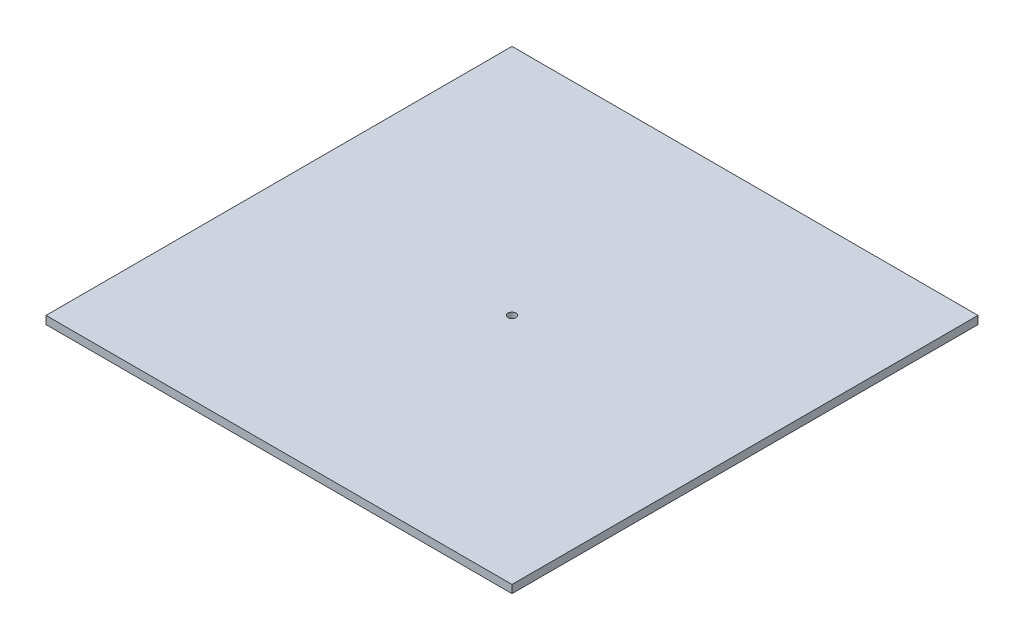
ISO-10303-21;
HEADER;
FILE_DESCRIPTION(('STEP AP214'),'2;1');
FILE_NAME('part.step','',(''),(''),'','','');
FILE_SCHEMA(('AUTOMOTIVE_DESIGN { 1 0 10303 214 1 1 1 1 }'));
ENDSEC;
DATA;
#1=APPLICATION_CONTEXT('core data for automotive mechanical design processes');
#2=APPLICATION_PROTOCOL_DEFINITION('international standard','automotive_design',2000,#1);
#3=PRODUCT_CONTEXT('',#1,'mechanical');
#4=PRODUCT('Part','Part','',(#3));
#5=PRODUCT_RELATED_PRODUCT_CATEGORY('part','',(#4));
#6=PRODUCT_DEFINITION_FORMATION('','',#4);
#7=PRODUCT_DEFINITION_CONTEXT('part definition',#1,'design');
#8=PRODUCT_DEFINITION('design','',#6,#7);
#9=PRODUCT_DEFINITION_SHAPE('','',#8);
#10=(LENGTH_UNIT() NAMED_UNIT(*) SI_UNIT(.MILLI.,.METRE.));
#11=(NAMED_UNIT(*) PLANE_ANGLE_UNIT() SI_UNIT($,.RADIAN.));
#12=(NAMED_UNIT(*) SI_UNIT($,.STERADIAN.) SOLID_ANGLE_UNIT());
#13=UNCERTAINTY_MEASURE_WITH_UNIT(LENGTH_MEASURE(1.E-05),#10,'distance_accuracy_value','');
#14=(GEOMETRIC_REPRESENTATION_CONTEXT(3) GLOBAL_UNCERTAINTY_ASSIGNED_CONTEXT((#13)) GLOBAL_UNIT_ASSIGNED_CONTEXT((#10,
#11,#12)) REPRESENTATION_CONTEXT('',''));
#15=CARTESIAN_POINT('',(0.,0.,0.));
#16=DIRECTION('',(0.,0.,1.));
#17=DIRECTION('',(1.,0.,0.));
#18=AXIS2_PLACEMENT_3D('',#15,#16,#17);
#19=CARTESIAN_POINT('',(175.,6.00000000000001,175.));
#20=DIRECTION('',(-1.,0.,0.));
#21=DIRECTION('',(0.,0.,1.));
#22=AXIS2_PLACEMENT_3D('',#19,#20,#21);
#23=PLANE('',#22);
#24=DIRECTION('',(0.,0.,-1.));
#25=VECTOR('',#24,1.);
#26=CARTESIAN_POINT('',(175.,0.,175.));
#27=LINE('',#26,#25);
#28=CARTESIAN_POINT('',(175.,0.,175.));
#29=VERTEX_POINT('',#28);
#30=CARTESIAN_POINT('',(175.,0.,-175.));
#31=VERTEX_POINT('',#30);
#32=EDGE_CURVE('E98',#29,#31,#27,.T.);
#33=ORIENTED_EDGE('',*,*,#32,.T.);
#34=DIRECTION('',(0.,-1.,0.));
#35=VECTOR('',#34,1.);
#36=CARTESIAN_POINT('',(175.,6.00000000000001,-175.));
#37=LINE('',#36,#35);
#38=CARTESIAN_POINT('',(175.,6.00000000000001,-175.));
#39=VERTEX_POINT('',#38);
#40=EDGE_CURVE('E11',#39,#31,#37,.T.);
#41=ORIENTED_EDGE('',*,*,#40,.F.);
#42=DIRECTION('',(0.,0.,-1.));
#43=VECTOR('',#42,1.);
#44=CARTESIAN_POINT('',(175.,6.00000000000001,175.));
#45=LINE('',#44,#43);
#46=CARTESIAN_POINT('',(175.,6.00000000000001,175.));
#47=VERTEX_POINT('',#46);
#48=EDGE_CURVE('E86',#47,#39,#45,.T.);
#49=ORIENTED_EDGE('',*,*,#48,.F.);
#50=DIRECTION('',(0.,-1.,0.));
#51=VECTOR('',#50,1.);
#52=CARTESIAN_POINT('',(175.,6.00000000000001,175.));
#53=LINE('',#52,#51);
#54=EDGE_CURVE('E94',#47,#29,#53,.T.);
#55=ORIENTED_EDGE('',*,*,#54,.T.);
#56=EDGE_LOOP('',(#33,#41,#49,#55));
#57=FACE_BOUND('',#56,.T.);
#58=ADVANCED_FACE('F35',(#57),#23,.F.);
#59=CARTESIAN_POINT('',(-175.,6.00000000000001,-175.));
#60=DIRECTION('',(0.,0.,1.));
#61=DIRECTION('',(1.,0.,0.));
#62=AXIS2_PLACEMENT_3D('',#59,#60,#61);
#63=PLANE('',#62);
#64=DIRECTION('',(-1.,0.,0.));
#65=VECTOR('',#64,1.);
#66=CARTESIAN_POINT('',(-175.,0.,-175.));
#67=LINE('',#66,#65);
#68=CARTESIAN_POINT('',(-175.,0.,-175.));
#69=VERTEX_POINT('',#68);
#70=EDGE_CURVE('E90',#31,#69,#67,.T.);
#71=ORIENTED_EDGE('',*,*,#70,.T.);
#72=DIRECTION('',(0.,-1.,0.));
#73=VECTOR('',#72,1.);
#74=CARTESIAN_POINT('',(-175.,6.00000000000001,-175.));
#75=LINE('',#74,#73);
#76=CARTESIAN_POINT('',(-175.,6.00000000000001,-175.));
#77=VERTEX_POINT('',#76);
#78=EDGE_CURVE('E43',#77,#69,#75,.T.);
#79=ORIENTED_EDGE('',*,*,#78,.F.);
#80=DIRECTION('',(-1.,0.,0.));
#81=VECTOR('',#80,1.);
#82=CARTESIAN_POINT('',(-175.,6.00000000000001,-175.));
#83=LINE('',#82,#81);
#84=EDGE_CURVE('E81',#39,#77,#83,.T.);
#85=ORIENTED_EDGE('',*,*,#84,.F.);
#86=ORIENTED_EDGE('',*,*,#40,.T.);
#87=EDGE_LOOP('',(#71,#79,#85,#86));
#88=FACE_BOUND('',#87,.T.);
#89=ADVANCED_FACE('F89',(#88),#63,.F.);
#90=CARTESIAN_POINT('',(-175.,6.00000000000001,175.));
#91=DIRECTION('',(1.,0.,0.));
#92=DIRECTION('',(0.,0.,-1.));
#93=AXIS2_PLACEMENT_3D('',#90,#91,#92);
#94=PLANE('',#93);
#95=DIRECTION('',(0.,0.,1.));
#96=VECTOR('',#95,1.);
#97=CARTESIAN_POINT('',(-175.,0.,175.));
#98=LINE('',#97,#96);
#99=CARTESIAN_POINT('',(-175.,0.,175.));
#100=VERTEX_POINT('',#99);
#101=EDGE_CURVE('E68',#69,#100,#98,.T.);
#102=ORIENTED_EDGE('',*,*,#101,.T.);
#103=DIRECTION('',(0.,-1.,0.));
#104=VECTOR('',#103,1.);
#105=CARTESIAN_POINT('',(-175.,6.00000000000001,175.));
#106=LINE('',#105,#104);
#107=CARTESIAN_POINT('',(-175.,6.00000000000001,175.));
#108=VERTEX_POINT('',#107);
#109=EDGE_CURVE('E91',#108,#100,#106,.T.);
#110=ORIENTED_EDGE('',*,*,#109,.F.);
#111=DIRECTION('',(0.,0.,1.));
#112=VECTOR('',#111,1.);
#113=CARTESIAN_POINT('',(-175.,6.00000000000001,175.));
#114=LINE('',#113,#112);
#115=EDGE_CURVE('E84',#77,#108,#114,.T.);
#116=ORIENTED_EDGE('',*,*,#115,.F.);
#117=ORIENTED_EDGE('',*,*,#78,.T.);
#118=EDGE_LOOP('',(#102,#110,#116,#117));
#119=FACE_BOUND('',#118,.T.);
#120=ADVANCED_FACE('F92',(#119),#94,.F.);
#121=CARTESIAN_POINT('',(-175.,6.00000000000001,175.));
#122=DIRECTION('',(0.,0.,-1.));
#123=DIRECTION('',(-1.,0.,0.));
#124=AXIS2_PLACEMENT_3D('',#121,#122,#123);
#125=PLANE('',#124);
#126=DIRECTION('',(1.,0.,0.));
#127=VECTOR('',#126,1.);
#128=CARTESIAN_POINT('',(-175.,0.,175.));
#129=LINE('',#128,#127);
#130=EDGE_CURVE('E74',#100,#29,#129,.T.);
#131=ORIENTED_EDGE('',*,*,#130,.T.);
#132=ORIENTED_EDGE('',*,*,#54,.F.);
#133=DIRECTION('',(1.,0.,0.));
#134=VECTOR('',#133,1.);
#135=CARTESIAN_POINT('',(-175.,6.00000000000001,175.));
#136=LINE('',#135,#134);
#137=EDGE_CURVE('E51',#108,#47,#136,.T.);
#138=ORIENTED_EDGE('',*,*,#137,.F.);
#139=ORIENTED_EDGE('',*,*,#109,.T.);
#140=EDGE_LOOP('',(#131,#132,#138,#139));
#141=FACE_BOUND('',#140,.T.);
#142=ADVANCED_FACE('F106',(#141),#125,.F.);
#143=CARTESIAN_POINT('',(0.,6.00000000000001,0.));
#144=DIRECTION('',(0.,-1.,0.));
#145=DIRECTION('',(0.,0.,-1.));
#146=AXIS2_PLACEMENT_3D('',#143,#144,#145);
#147=PLANE('',#146);
#148=CARTESIAN_POINT('',(0.,6.00000000000001,0.));
#149=DIRECTION('',(0.,-1.,0.));
#150=DIRECTION('',(0.,0.,-1.));
#151=AXIS2_PLACEMENT_3D('',#148,#149,#150);
#152=CIRCLE('',#151,3.);
#153=CARTESIAN_POINT('',(0.,6.00000000000001,-3.));
#154=VERTEX_POINT('',#153);
#155=EDGE_CURVE('E101',#154,#154,#152,.T.);
#156=ORIENTED_EDGE('',*,*,#155,.T.);
#157=EDGE_LOOP('',(#156));
#158=FACE_BOUND('',#157,.T.);
#159=ORIENTED_EDGE('',*,*,#48,.T.);
#160=ORIENTED_EDGE('',*,*,#84,.T.);
#161=ORIENTED_EDGE('',*,*,#115,.T.);
#162=ORIENTED_EDGE('',*,*,#137,.T.);
#163=EDGE_LOOP('',(#159,#160,#161,#162));
#164=FACE_BOUND('',#163,.T.);
#165=ADVANCED_FACE('F82',(#158,#164),#147,.F.);
#166=CARTESIAN_POINT('',(0.,0.,0.));
#167=DIRECTION('',(0.,-1.,0.));
#168=DIRECTION('',(0.,0.,-1.));
#169=AXIS2_PLACEMENT_3D('',#166,#167,#168);
#170=PLANE('',#169);
#171=CARTESIAN_POINT('',(0.,0.,0.));
#172=DIRECTION('',(0.,1.,0.));
#173=DIRECTION('',(0.,0.,1.));
#174=AXIS2_PLACEMENT_3D('',#171,#172,#173);
#175=CIRCLE('',#174,3.);
#176=CARTESIAN_POINT('',(0.,0.,3.));
#177=VERTEX_POINT('',#176);
#178=EDGE_CURVE('E114',#177,#177,#175,.T.);
#179=ORIENTED_EDGE('',*,*,#178,.T.);
#180=EDGE_LOOP('',(#179));
#181=FACE_BOUND('',#180,.T.);
#182=ORIENTED_EDGE('',*,*,#32,.F.);
#183=ORIENTED_EDGE('',*,*,#130,.F.);
#184=ORIENTED_EDGE('',*,*,#101,.F.);
#185=ORIENTED_EDGE('',*,*,#70,.F.);
#186=EDGE_LOOP('',(#182,#183,#184,#185));
#187=FACE_BOUND('',#186,.T.);
#188=ADVANCED_FACE('F109',(#181,#187),#170,.T.);
#189=CARTESIAN_POINT('',(0.,0.,0.));
#190=DIRECTION('',(0.,1.,0.));
#191=DIRECTION('',(0.,0.,1.));
#192=AXIS2_PLACEMENT_3D('',#189,#190,#191);
#193=CYLINDRICAL_SURFACE('',#192,3.);
#194=ORIENTED_EDGE('',*,*,#178,.F.);
#195=EDGE_LOOP('',(#194));
#196=FACE_BOUND('',#195,.T.);
#197=ORIENTED_EDGE('',*,*,#155,.F.);
#198=EDGE_LOOP('',(#197));
#199=FACE_BOUND('',#198,.T.);
#200=ADVANCED_FACE('F119',(#196,#199),#193,.F.);
#201=CLOSED_SHELL('',(#58,#89,#120,#142,#165,#188,#200));
#202=MANIFOLD_SOLID_BREP('B2',#201);
#203=ADVANCED_BREP_SHAPE_REPRESENTATION('',(#18,#202),#14);
#204=SHAPE_DEFINITION_REPRESENTATION(#9,#203);
ENDSEC;
END-ISO-10303-21;
